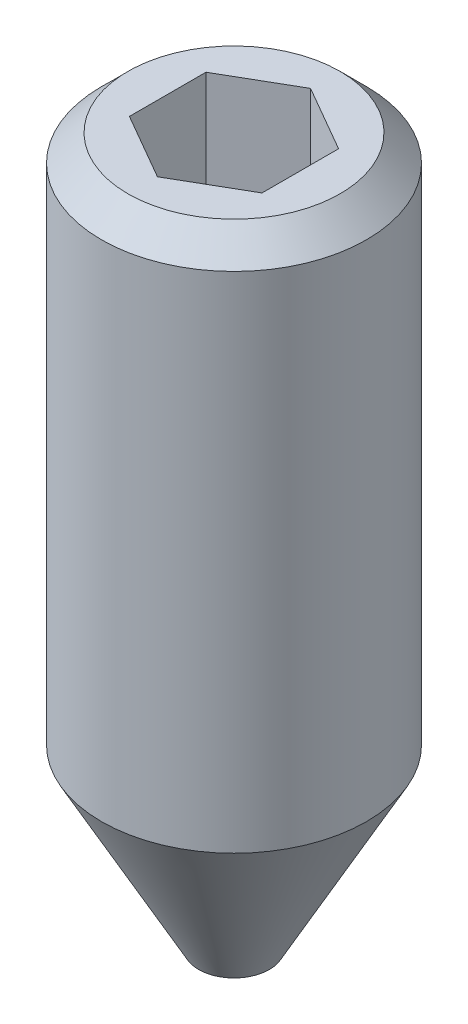
ISO-10303-21;
HEADER;
FILE_DESCRIPTION(('STEP AP214'),'2;1');
FILE_NAME('part.step','',(''),(''),'','','');
FILE_SCHEMA(('AUTOMOTIVE_DESIGN { 1 0 10303 214 1 1 1 1 }'));
ENDSEC;
DATA;
#1=APPLICATION_CONTEXT('core data for automotive mechanical design processes');
#2=APPLICATION_PROTOCOL_DEFINITION('international standard','automotive_design',2000,#1);
#3=PRODUCT_CONTEXT('',#1,'mechanical');
#4=PRODUCT('Part','Part','',(#3));
#5=PRODUCT_RELATED_PRODUCT_CATEGORY('part','',(#4));
#6=PRODUCT_DEFINITION_FORMATION('','',#4);
#7=PRODUCT_DEFINITION_CONTEXT('part definition',#1,'design');
#8=PRODUCT_DEFINITION('design','',#6,#7);
#9=PRODUCT_DEFINITION_SHAPE('','',#8);
#10=(LENGTH_UNIT() NAMED_UNIT(*) SI_UNIT(.MILLI.,.METRE.));
#11=(NAMED_UNIT(*) PLANE_ANGLE_UNIT() SI_UNIT($,.RADIAN.));
#12=(NAMED_UNIT(*) SI_UNIT($,.STERADIAN.) SOLID_ANGLE_UNIT());
#13=UNCERTAINTY_MEASURE_WITH_UNIT(LENGTH_MEASURE(1.E-05),#10,'distance_accuracy_value','');
#14=(GEOMETRIC_REPRESENTATION_CONTEXT(3) GLOBAL_UNCERTAINTY_ASSIGNED_CONTEXT((#13)) GLOBAL_UNIT_ASSIGNED_CONTEXT((#10,
#11,#12)) REPRESENTATION_CONTEXT('',''));
#15=CARTESIAN_POINT('',(0.,0.,0.));
#16=DIRECTION('',(0.,0.,1.));
#17=DIRECTION('',(1.,0.,0.));
#18=AXIS2_PLACEMENT_3D('',#15,#16,#17);
#19=CARTESIAN_POINT('',(0.,-8.,0.));
#20=DIRECTION('',(0.,-1.,0.));
#21=DIRECTION('',(0.,0.,-1.));
#22=AXIS2_PLACEMENT_3D('',#19,#20,#21);
#23=PLANE('',#22);
#24=CARTESIAN_POINT('',(0.,-8.,0.));
#25=DIRECTION('',(0.,-1.,0.));
#26=DIRECTION('',(0.,0.,-1.));
#27=AXIS2_PLACEMENT_3D('',#24,#25,#26);
#28=CIRCLE('',#27,0.4);
#29=CARTESIAN_POINT('',(0.,-8.,0.400000000000001));
#30=VERTEX_POINT('',#29);
#31=EDGE_CURVE('E11',#30,#30,#28,.T.);
#32=ORIENTED_EDGE('',*,*,#31,.T.);
#33=EDGE_LOOP('',(#32));
#34=FACE_BOUND('',#33,.T.);
#35=ADVANCED_FACE('F36',(#34),#23,.T.);
#36=CARTESIAN_POINT('',(0.,-8.,0.));
#37=DIRECTION('',(0.,1.,0.));
#38=DIRECTION('',(0.,0.,1.));
#39=AXIS2_PLACEMENT_3D('',#36,#37,#38);
#40=CONICAL_SURFACE('',#39,0.4,0.502843210927861);
#41=CARTESIAN_POINT('',(0.,-6.,0.));
#42=DIRECTION('',(0.,-1.,0.));
#43=DIRECTION('',(0.,0.,-1.));
#44=AXIS2_PLACEMENT_3D('',#41,#42,#43);
#45=CIRCLE('',#44,1.5);
#46=CARTESIAN_POINT('',(0.,-6.,1.5));
#47=VERTEX_POINT('',#46);
#48=EDGE_CURVE('E43',#47,#47,#45,.T.);
#49=CARTESIAN_POINT('',(0.,-6.,1.5));
#50=CARTESIAN_POINT('',(0.,-6.02083333333333,1.48854166666667));
#51=CARTESIAN_POINT('',(0.,-6.04166666666666,1.47708333333333));
#52=CARTESIAN_POINT('',(0.,-6.08333333333333,1.45416666666667));
#53=CARTESIAN_POINT('',(0.,-6.10416666666666,1.44270833333333));
#54=CARTESIAN_POINT('',(0.,-6.14583333333333,1.41979166666667));
#55=CARTESIAN_POINT('',(0.,-6.16666666666666,1.40833333333333));
#56=CARTESIAN_POINT('',(0.,-6.20833333333333,1.38541666666667));
#57=CARTESIAN_POINT('',(0.,-6.22916666666666,1.37395833333333));
#58=CARTESIAN_POINT('',(0.,-6.27083333333333,1.35104166666667));
#59=CARTESIAN_POINT('',(0.,-6.29166666666666,1.33958333333333));
#60=CARTESIAN_POINT('',(0.,-6.33333333333333,1.31666666666667));
#61=CARTESIAN_POINT('',(0.,-6.35416666666666,1.30520833333333));
#62=CARTESIAN_POINT('',(0.,-6.39583333333333,1.28229166666667));
#63=CARTESIAN_POINT('',(0.,-6.41666666666666,1.27083333333333));
#64=CARTESIAN_POINT('',(0.,-6.45833333333333,1.24791666666667));
#65=CARTESIAN_POINT('',(0.,-6.47916666666666,1.23645833333333));
#66=CARTESIAN_POINT('',(0.,-6.52083333333333,1.21354166666667));
#67=CARTESIAN_POINT('',(0.,-6.54166666666666,1.20208333333333));
#68=CARTESIAN_POINT('',(0.,-6.58333333333333,1.17916666666667));
#69=CARTESIAN_POINT('',(0.,-6.60416666666666,1.16770833333333));
#70=CARTESIAN_POINT('',(0.,-6.64583333333333,1.14479166666667));
#71=CARTESIAN_POINT('',(0.,-6.66666666666666,1.13333333333333));
#72=CARTESIAN_POINT('',(0.,-6.70833333333333,1.11041666666667));
#73=CARTESIAN_POINT('',(0.,-6.72916666666666,1.09895833333333));
#74=CARTESIAN_POINT('',(0.,-6.77083333333333,1.07604166666667));
#75=CARTESIAN_POINT('',(0.,-6.79166666666666,1.06458333333333));
#76=CARTESIAN_POINT('',(0.,-6.83333333333333,1.04166666666667));
#77=CARTESIAN_POINT('',(0.,-6.85416666666666,1.03020833333333));
#78=CARTESIAN_POINT('',(0.,-6.89583333333333,1.00729166666667));
#79=CARTESIAN_POINT('',(0.,-6.91666666666666,0.995833333333334));
#80=CARTESIAN_POINT('',(0.,-6.95833333333333,0.972916666666667));
#81=CARTESIAN_POINT('',(0.,-6.97916666666667,0.961458333333334));
#82=CARTESIAN_POINT('',(0.,-7.02083333333333,0.938541666666667));
#83=CARTESIAN_POINT('',(0.,-7.04166666666667,0.927083333333334));
#84=CARTESIAN_POINT('',(0.,-7.08333333333333,0.904166666666667));
#85=CARTESIAN_POINT('',(0.,-7.10416666666667,0.892708333333334));
#86=CARTESIAN_POINT('',(0.,-7.14583333333333,0.869791666666667));
#87=CARTESIAN_POINT('',(0.,-7.16666666666667,0.858333333333334));
#88=CARTESIAN_POINT('',(0.,-7.20833333333333,0.835416666666667));
#89=CARTESIAN_POINT('',(0.,-7.22916666666667,0.823958333333334));
#90=CARTESIAN_POINT('',(0.,-7.27083333333333,0.801041666666667));
#91=CARTESIAN_POINT('',(0.,-7.29166666666667,0.789583333333334));
#92=CARTESIAN_POINT('',(0.,-7.33333333333333,0.766666666666667));
#93=CARTESIAN_POINT('',(0.,-7.35416666666667,0.755208333333334));
#94=CARTESIAN_POINT('',(0.,-7.39583333333333,0.732291666666667));
#95=CARTESIAN_POINT('',(0.,-7.41666666666667,0.720833333333334));
#96=CARTESIAN_POINT('',(0.,-7.45833333333333,0.697916666666667));
#97=CARTESIAN_POINT('',(0.,-7.47916666666667,0.686458333333334));
#98=CARTESIAN_POINT('',(0.,-7.52083333333333,0.663541666666667));
#99=CARTESIAN_POINT('',(0.,-7.54166666666667,0.652083333333334));
#100=CARTESIAN_POINT('',(0.,-7.58333333333333,0.629166666666667));
#101=CARTESIAN_POINT('',(0.,-7.60416666666667,0.617708333333334));
#102=CARTESIAN_POINT('',(0.,-7.64583333333333,0.594791666666667));
#103=CARTESIAN_POINT('',(0.,-7.66666666666667,0.583333333333334));
#104=CARTESIAN_POINT('',(0.,-7.70833333333333,0.560416666666667));
#105=CARTESIAN_POINT('',(0.,-7.72916666666667,0.548958333333334));
#106=CARTESIAN_POINT('',(0.,-7.77083333333333,0.526041666666667));
#107=CARTESIAN_POINT('',(0.,-7.79166666666667,0.514583333333334));
#108=CARTESIAN_POINT('',(0.,-7.83333333333333,0.491666666666667));
#109=CARTESIAN_POINT('',(0.,-7.85416666666667,0.480208333333334));
#110=CARTESIAN_POINT('',(0.,-7.89583333333333,0.457291666666667));
#111=CARTESIAN_POINT('',(0.,-7.91666666666667,0.445833333333334));
#112=CARTESIAN_POINT('',(0.,-7.95833333333333,0.422916666666667));
#113=CARTESIAN_POINT('',(0.,-7.97916666666667,0.411458333333334));
#114=CARTESIAN_POINT('',(0.,-8.,0.400000000000001));
#115=B_SPLINE_CURVE_WITH_KNOTS('',3,(#49,#50,#51,#52,#53,#54,#55,#56,#57,#58,#59,#60,#61,#62,
#63,#64,#65,#66,#67,#68,#69,#70,#71,#72,#73,#74,#75,#76,#77,#78,#79,#80,#81,#82,#83,#84,#85,#86,
#87,#88,#89,#90,#91,#92,#93,#94,#95,#96,#97,#98,#99,#100,#101,#102,#103,#104,#105,#106,#107,
#108,#109,#110,#111,#112,#113,#114),.UNSPECIFIED.,.F.,.F.,(4,2,2,2,2,2,2,2,2,2,2,2,2,2,2,2,2,2,
2,2,2,2,2,2,2,2,2,2,2,2,2,2,4),(0.,0.0713294513157084,0.142658902631417,0.213988353947125,
0.285317805262833,0.356647256578542,0.42797670789425,0.499306159209959,0.570635610525667,
0.641965061841375,0.713294513157083,0.784623964472792,0.8559534157885,0.927282867104209,
0.998612318419917,1.06994176973563,1.14127122105133,1.21260067236704,1.28393012368275,
1.35525957499846,1.42658902631417,1.49791847762988,1.56924792894558,1.64057738026129,
1.711906831577,1.78323628289271,1.85456573420842,1.92589518552413,1.99722463683983,
2.06855408815554,2.13988353947125,2.21121299078696,2.28254244210267),.UNSPECIFIED.);
#116=EDGE_CURVE('BSEAM151',#47,#30,#115,.T.);
#117=ORIENTED_EDGE('',*,*,#48,.T.);
#118=ORIENTED_EDGE('',*,*,#31,.F.);
#119=ORIENTED_EDGE('',*,*,#116,.T.);
#120=ORIENTED_EDGE('',*,*,#116,.F.);
#121=EDGE_LOOP('',(#117,#119,#118,#120));
#122=FACE_BOUND('',#121,.T.);
#123=ADVANCED_FACE('F151',(#122),#40,.T.);
#124=CARTESIAN_POINT('',(0.,-34.,0.));
#125=DIRECTION('',(0.,-1.,0.));
#126=DIRECTION('',(0.,0.,-1.));
#127=AXIS2_PLACEMENT_3D('',#124,#125,#126);
#128=CYLINDRICAL_SURFACE('',#127,1.5);
#129=CARTESIAN_POINT('',(0.,-0.300000000000002,0.));
#130=DIRECTION('',(0.,-1.,0.));
#131=DIRECTION('',(0.,0.,-1.));
#132=AXIS2_PLACEMENT_3D('',#129,#130,#131);
#133=CIRCLE('',#132,1.5);
#134=CARTESIAN_POINT('',(0.,-0.300000000000002,-1.5));
#135=VERTEX_POINT('',#134);
#136=EDGE_CURVE('E146',#135,#135,#133,.T.);
#137=ORIENTED_EDGE('',*,*,#136,.T.);
#138=EDGE_LOOP('',(#137));
#139=FACE_BOUND('',#138,.T.);
#140=ORIENTED_EDGE('',*,*,#48,.F.);
#141=EDGE_LOOP('',(#140));
#142=FACE_BOUND('',#141,.T.);
#143=ADVANCED_FACE('F154',(#139,#142),#128,.T.);
#144=CARTESIAN_POINT('',(0.,-0.300000000000002,0.));
#145=DIRECTION('',(0.,-1.,0.));
#146=DIRECTION('',(0.,0.,-1.));
#147=AXIS2_PLACEMENT_3D('',#144,#145,#146);
#148=CONICAL_SURFACE('',#147,1.5,0.785398163397445);
#149=CARTESIAN_POINT('',(0.,0.,0.));
#150=DIRECTION('',(0.,-1.,0.));
#151=DIRECTION('',(0.,0.,-1.));
#152=AXIS2_PLACEMENT_3D('',#149,#150,#151);
#153=CIRCLE('',#152,1.2);
#154=CARTESIAN_POINT('',(0.,0.,-1.2));
#155=VERTEX_POINT('',#154);
#156=EDGE_CURVE('E137',#155,#155,#153,.T.);
#157=ORIENTED_EDGE('',*,*,#156,.T.);
#158=EDGE_LOOP('',(#157));
#159=FACE_BOUND('',#158,.T.);
#160=ORIENTED_EDGE('',*,*,#136,.F.);
#161=EDGE_LOOP('',(#160));
#162=FACE_BOUND('',#161,.T.);
#163=ADVANCED_FACE('F156',(#159,#162),#148,.T.);
#164=CARTESIAN_POINT('',(1.2,0.,0.));
#165=DIRECTION('',(0.,1.,0.));
#166=DIRECTION('',(0.,0.,1.));
#167=AXIS2_PLACEMENT_3D('',#164,#165,#166);
#168=PLANE('',#167);
#169=DIRECTION('',(0.,0.,-1.));
#170=VECTOR('',#169,1.);
#171=CARTESIAN_POINT('',(0.750000000010313,0.,0.433012701901576));
#172=LINE('',#171,#170);
#173=CARTESIAN_POINT('',(0.750000000010313,0.,0.433012701901576));
#174=VERTEX_POINT('',#173);
#175=CARTESIAN_POINT('',(0.750000000010313,0.,-0.433012701870955));
#176=VERTEX_POINT('',#175);
#177=EDGE_CURVE('E50',#174,#176,#172,.T.);
#178=ORIENTED_EDGE('',*,*,#177,.F.);
#179=DIRECTION('',(0.866025403784439,0.,-0.5));
#180=VECTOR('',#179,1.);
#181=CARTESIAN_POINT('',(7.36614337613133E-12,0.,0.866025403795496));
#182=LINE('',#181,#180);
#183=CARTESIAN_POINT('',(7.36614337613133E-12,0.,0.866025403795496));
#184=VERTEX_POINT('',#183);
#185=EDGE_CURVE('E133',#184,#174,#182,.T.);
#186=ORIENTED_EDGE('',*,*,#185,.F.);
#187=DIRECTION('',(0.866025403784439,0.,0.5));
#188=VECTOR('',#187,1.);
#189=CARTESIAN_POINT('',(-0.74999999999558,0.,0.433012701901576));
#190=LINE('',#189,#188);
#191=CARTESIAN_POINT('',(-0.74999999999558,0.,0.433012701901576));
#192=VERTEX_POINT('',#191);
#193=EDGE_CURVE('E131',#192,#184,#190,.T.);
#194=ORIENTED_EDGE('',*,*,#193,.F.);
#195=DIRECTION('',(0.,0.,1.));
#196=VECTOR('',#195,1.);
#197=CARTESIAN_POINT('',(-0.74999999999558,0.,-0.433012701886265));
#198=LINE('',#197,#196);
#199=CARTESIAN_POINT('',(-0.74999999999558,0.,-0.433012701886265));
#200=VERTEX_POINT('',#199);
#201=EDGE_CURVE('E98',#200,#192,#198,.T.);
#202=ORIENTED_EDGE('',*,*,#201,.F.);
#203=DIRECTION('',(-0.866025403784439,0.,0.5));
#204=VECTOR('',#203,1.);
#205=CARTESIAN_POINT('',(7.36605398946302E-12,0.,-0.866025403780186));
#206=LINE('',#205,#204);
#207=CARTESIAN_POINT('',(7.36605398946302E-12,0.,-0.866025403780186));
#208=VERTEX_POINT('',#207);
#209=EDGE_CURVE('E127',#208,#200,#206,.T.);
#210=ORIENTED_EDGE('',*,*,#209,.F.);
#211=DIRECTION('',(-0.866025403776784,0.,-0.500000000013259));
#212=VECTOR('',#211,1.);
#213=CARTESIAN_POINT('',(0.750000000010313,0.,-0.433012701870955));
#214=LINE('',#213,#212);
#215=EDGE_CURVE('E124',#176,#208,#214,.T.);
#216=ORIENTED_EDGE('',*,*,#215,.F.);
#217=EDGE_LOOP('',(#178,#186,#194,#202,#210,#216));
#218=FACE_BOUND('',#217,.T.);
#219=ORIENTED_EDGE('',*,*,#156,.F.);
#220=EDGE_LOOP('',(#219));
#221=FACE_BOUND('',#220,.T.);
#222=ADVANCED_FACE('F163',(#218,#221),#168,.T.);
#223=CARTESIAN_POINT('',(0.750000000010313,-2.,0.433012701901576));
#224=DIRECTION('',(1.,0.,0.));
#225=DIRECTION('',(0.,0.,-1.));
#226=AXIS2_PLACEMENT_3D('',#223,#224,#225);
#227=PLANE('',#226);
#228=ORIENTED_EDGE('',*,*,#177,.T.);
#229=DIRECTION('',(0.,1.,0.));
#230=VECTOR('',#229,1.);
#231=CARTESIAN_POINT('',(0.750000000010313,-2.,-0.433012701870955));
#232=LINE('',#231,#230);
#233=CARTESIAN_POINT('',(0.750000000010313,-2.,-0.433012701870955));
#234=VERTEX_POINT('',#233);
#235=EDGE_CURVE('E80',#234,#176,#232,.T.);
#236=ORIENTED_EDGE('',*,*,#235,.F.);
#237=DIRECTION('',(0.,0.,-1.));
#238=VECTOR('',#237,1.);
#239=CARTESIAN_POINT('',(0.750000000010313,-2.,0.433012701901576));
#240=LINE('',#239,#238);
#241=CARTESIAN_POINT('',(0.750000000010313,-2.,0.433012701901576));
#242=VERTEX_POINT('',#241);
#243=EDGE_CURVE('E135',#242,#234,#240,.T.);
#244=ORIENTED_EDGE('',*,*,#243,.F.);
#245=DIRECTION('',(0.,1.,0.));
#246=VECTOR('',#245,1.);
#247=CARTESIAN_POINT('',(0.750000000010313,-2.,0.433012701901576));
#248=LINE('',#247,#246);
#249=EDGE_CURVE('E58',#242,#174,#248,.T.);
#250=ORIENTED_EDGE('',*,*,#249,.T.);
#251=EDGE_LOOP('',(#228,#236,#244,#250));
#252=FACE_BOUND('',#251,.T.);
#253=ADVANCED_FACE('F197',(#252),#227,.F.);
#254=CARTESIAN_POINT('',(7.36614337613133E-12,-2.,0.866025403795496));
#255=DIRECTION('',(0.5,0.,0.866025403784439));
#256=DIRECTION('',(0.866025403784439,0.,-0.5));
#257=AXIS2_PLACEMENT_3D('',#254,#255,#256);
#258=PLANE('',#257);
#259=ORIENTED_EDGE('',*,*,#185,.T.);
#260=ORIENTED_EDGE('',*,*,#249,.F.);
#261=DIRECTION('',(0.866025403784439,0.,-0.5));
#262=VECTOR('',#261,1.);
#263=CARTESIAN_POINT('',(7.36614337613133E-12,-2.,0.866025403795496));
#264=LINE('',#263,#262);
#265=CARTESIAN_POINT('',(7.36614337613133E-12,-2.,0.866025403795496));
#266=VERTEX_POINT('',#265);
#267=EDGE_CURVE('E110',#266,#242,#264,.T.);
#268=ORIENTED_EDGE('',*,*,#267,.F.);
#269=DIRECTION('',(0.,1.,0.));
#270=VECTOR('',#269,1.);
#271=CARTESIAN_POINT('',(7.36614337613133E-12,-2.,0.866025403795496));
#272=LINE('',#271,#270);
#273=EDGE_CURVE('E102',#266,#184,#272,.T.);
#274=ORIENTED_EDGE('',*,*,#273,.T.);
#275=EDGE_LOOP('',(#259,#260,#268,#274));
#276=FACE_BOUND('',#275,.T.);
#277=ADVANCED_FACE('F207',(#276),#258,.F.);
#278=CARTESIAN_POINT('',(-0.74999999999558,-2.,0.433012701901576));
#279=DIRECTION('',(-0.5,0.,0.866025403784439));
#280=DIRECTION('',(0.866025403784439,0.,0.5));
#281=AXIS2_PLACEMENT_3D('',#278,#279,#280);
#282=PLANE('',#281);
#283=ORIENTED_EDGE('',*,*,#193,.T.);
#284=ORIENTED_EDGE('',*,*,#273,.F.);
#285=DIRECTION('',(0.866025403784439,0.,0.5));
#286=VECTOR('',#285,1.);
#287=CARTESIAN_POINT('',(-0.74999999999558,-2.,0.433012701901576));
#288=LINE('',#287,#286);
#289=CARTESIAN_POINT('',(-0.74999999999558,-2.,0.433012701901576));
#290=VERTEX_POINT('',#289);
#291=EDGE_CURVE('E106',#290,#266,#288,.T.);
#292=ORIENTED_EDGE('',*,*,#291,.F.);
#293=DIRECTION('',(0.,1.,0.));
#294=VECTOR('',#293,1.);
#295=CARTESIAN_POINT('',(-0.74999999999558,-2.,0.433012701901576));
#296=LINE('',#295,#294);
#297=EDGE_CURVE('E91',#290,#192,#296,.T.);
#298=ORIENTED_EDGE('',*,*,#297,.T.);
#299=EDGE_LOOP('',(#283,#284,#292,#298));
#300=FACE_BOUND('',#299,.T.);
#301=ADVANCED_FACE('F107',(#300),#282,.F.);
#302=CARTESIAN_POINT('',(-0.74999999999558,-2.,-0.433012701886265));
#303=DIRECTION('',(-1.,0.,0.));
#304=DIRECTION('',(0.,0.,1.));
#305=AXIS2_PLACEMENT_3D('',#302,#303,#304);
#306=PLANE('',#305);
#307=ORIENTED_EDGE('',*,*,#201,.T.);
#308=ORIENTED_EDGE('',*,*,#297,.F.);
#309=DIRECTION('',(0.,0.,1.));
#310=VECTOR('',#309,1.);
#311=CARTESIAN_POINT('',(-0.74999999999558,-2.,-0.433012701886265));
#312=LINE('',#311,#310);
#313=CARTESIAN_POINT('',(-0.74999999999558,-2.,-0.433012701886265));
#314=VERTEX_POINT('',#313);
#315=EDGE_CURVE('E95',#314,#290,#312,.T.);
#316=ORIENTED_EDGE('',*,*,#315,.F.);
#317=DIRECTION('',(0.,1.,0.));
#318=VECTOR('',#317,1.);
#319=CARTESIAN_POINT('',(-0.74999999999558,-2.,-0.433012701886265));
#320=LINE('',#319,#318);
#321=EDGE_CURVE('E103',#314,#200,#320,.T.);
#322=ORIENTED_EDGE('',*,*,#321,.T.);
#323=EDGE_LOOP('',(#307,#308,#316,#322));
#324=FACE_BOUND('',#323,.T.);
#325=ADVANCED_FACE('F93',(#324),#306,.F.);
#326=CARTESIAN_POINT('',(7.36605398946302E-12,-2.,-0.866025403780186));
#327=DIRECTION('',(-0.5,0.,-0.866025403784439));
#328=DIRECTION('',(-0.866025403784439,0.,0.5));
#329=AXIS2_PLACEMENT_3D('',#326,#327,#328);
#330=PLANE('',#329);
#331=ORIENTED_EDGE('',*,*,#209,.T.);
#332=ORIENTED_EDGE('',*,*,#321,.F.);
#333=DIRECTION('',(-0.866025403784439,0.,0.5));
#334=VECTOR('',#333,1.);
#335=CARTESIAN_POINT('',(7.36605398946302E-12,-2.,-0.866025403780186));
#336=LINE('',#335,#334);
#337=CARTESIAN_POINT('',(7.36605398946302E-12,-2.,-0.866025403780186));
#338=VERTEX_POINT('',#337);
#339=EDGE_CURVE('E116',#338,#314,#336,.T.);
#340=ORIENTED_EDGE('',*,*,#339,.F.);
#341=DIRECTION('',(0.,1.,0.));
#342=VECTOR('',#341,1.);
#343=CARTESIAN_POINT('',(7.36605398946302E-12,-2.,-0.866025403780186));
#344=LINE('',#343,#342);
#345=EDGE_CURVE('E140',#338,#208,#344,.T.);
#346=ORIENTED_EDGE('',*,*,#345,.T.);
#347=EDGE_LOOP('',(#331,#332,#340,#346));
#348=FACE_BOUND('',#347,.T.);
#349=ADVANCED_FACE('F232',(#348),#330,.F.);
#350=CARTESIAN_POINT('',(0.750000000010313,-2.,-0.433012701870955));
#351=DIRECTION('',(0.500000000013259,0.,-0.866025403776784));
#352=DIRECTION('',(-0.866025403776784,0.,-0.500000000013259));
#353=AXIS2_PLACEMENT_3D('',#350,#351,#352);
#354=PLANE('',#353);
#355=ORIENTED_EDGE('',*,*,#215,.T.);
#356=ORIENTED_EDGE('',*,*,#345,.F.);
#357=DIRECTION('',(-0.866025403776784,0.,-0.500000000013259));
#358=VECTOR('',#357,1.);
#359=CARTESIAN_POINT('',(0.750000000010313,-2.,-0.433012701870955));
#360=LINE('',#359,#358);
#361=EDGE_CURVE('E118',#234,#338,#360,.T.);
#362=ORIENTED_EDGE('',*,*,#361,.F.);
#363=ORIENTED_EDGE('',*,*,#235,.T.);
#364=EDGE_LOOP('',(#355,#356,#362,#363));
#365=FACE_BOUND('',#364,.T.);
#366=ADVANCED_FACE('F241',(#365),#354,.F.);
#367=CARTESIAN_POINT('',(0.750000000010313,-2.,-1.29903810567411));
#368=DIRECTION('',(0.,1.,0.));
#369=DIRECTION('',(0.,0.,1.));
#370=AXIS2_PLACEMENT_3D('',#367,#368,#369);
#371=PLANE('',#370);
#372=ORIENTED_EDGE('',*,*,#243,.T.);
#373=ORIENTED_EDGE('',*,*,#361,.T.);
#374=ORIENTED_EDGE('',*,*,#339,.T.);
#375=ORIENTED_EDGE('',*,*,#315,.T.);
#376=ORIENTED_EDGE('',*,*,#291,.T.);
#377=ORIENTED_EDGE('',*,*,#267,.T.);
#378=EDGE_LOOP('',(#372,#373,#374,#375,#376,#377));
#379=FACE_BOUND('',#378,.T.);
#380=ADVANCED_FACE('F113',(#379),#371,.T.);
#381=CLOSED_SHELL('',(#35,#123,#143,#163,#222,#253,#277,#301,#325,#349,#366,#380));
#382=MANIFOLD_SOLID_BREP('B2',#381);
#383=ADVANCED_BREP_SHAPE_REPRESENTATION('',(#18,#382),#14);
#384=SHAPE_DEFINITION_REPRESENTATION(#9,#383);
ENDSEC;
END-ISO-10303-21;
